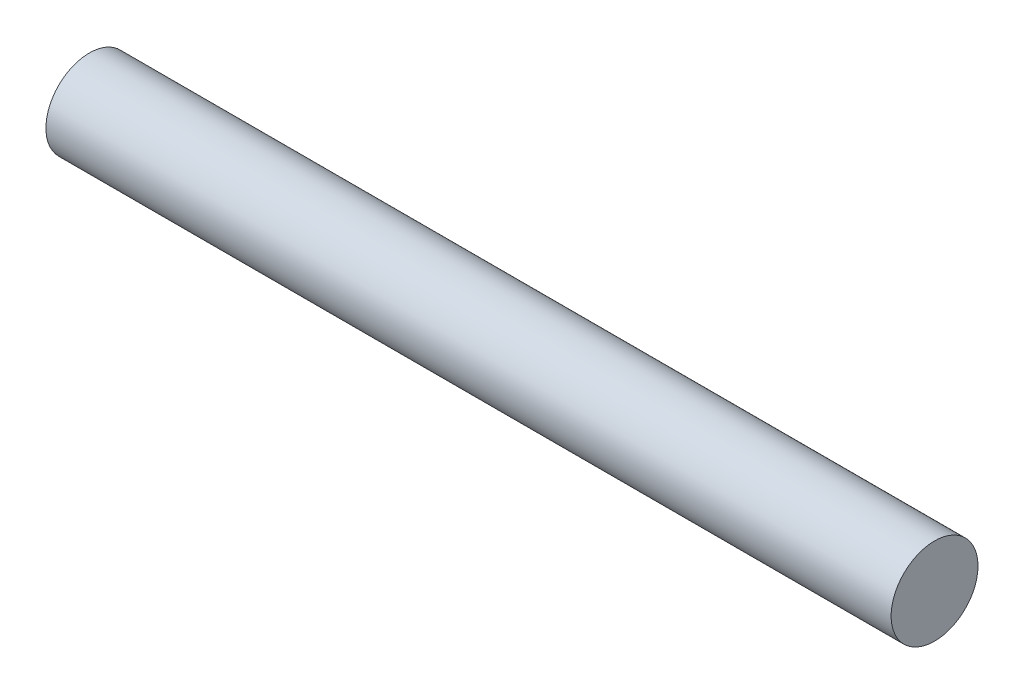
ISO-10303-21;
HEADER;
FILE_DESCRIPTION(('STEP AP214'),'2;1');
FILE_NAME('part.step','',(''),(''),'','','');
FILE_SCHEMA(('AUTOMOTIVE_DESIGN { 1 0 10303 214 1 1 1 1 }'));
ENDSEC;
DATA;
#1=APPLICATION_CONTEXT('core data for automotive mechanical design processes');
#2=APPLICATION_PROTOCOL_DEFINITION('international standard','automotive_design',2000,#1);
#3=PRODUCT_CONTEXT('',#1,'mechanical');
#4=PRODUCT('Part','Part','',(#3));
#5=PRODUCT_RELATED_PRODUCT_CATEGORY('part','',(#4));
#6=PRODUCT_DEFINITION_FORMATION('','',#4);
#7=PRODUCT_DEFINITION_CONTEXT('part definition',#1,'design');
#8=PRODUCT_DEFINITION('design','',#6,#7);
#9=PRODUCT_DEFINITION_SHAPE('','',#8);
#10=(LENGTH_UNIT() NAMED_UNIT(*) SI_UNIT(.MILLI.,.METRE.));
#11=(NAMED_UNIT(*) PLANE_ANGLE_UNIT() SI_UNIT($,.RADIAN.));
#12=(NAMED_UNIT(*) SI_UNIT($,.STERADIAN.) SOLID_ANGLE_UNIT());
#13=UNCERTAINTY_MEASURE_WITH_UNIT(LENGTH_MEASURE(1.E-05),#10,'distance_accuracy_value','');
#14=(GEOMETRIC_REPRESENTATION_CONTEXT(3) GLOBAL_UNCERTAINTY_ASSIGNED_CONTEXT((#13)) GLOBAL_UNIT_ASSIGNED_CONTEXT((#10,
#11,#12)) REPRESENTATION_CONTEXT('',''));
#15=CARTESIAN_POINT('',(0.,0.,0.));
#16=DIRECTION('',(0.,0.,1.));
#17=DIRECTION('',(1.,0.,0.));
#18=AXIS2_PLACEMENT_3D('',#15,#16,#17);
#19=CARTESIAN_POINT('',(18.,0.,0.));
#20=DIRECTION('',(-1.,0.,0.));
#21=DIRECTION('',(0.,0.,1.));
#22=AXIS2_PLACEMENT_3D('',#19,#20,#21);
#23=CYLINDRICAL_SURFACE('',#22,0.925);
#24=CARTESIAN_POINT('',(18.,0.,0.));
#25=DIRECTION('',(1.,0.,0.));
#26=DIRECTION('',(0.,0.,-1.));
#27=AXIS2_PLACEMENT_3D('',#24,#25,#26);
#28=CIRCLE('',#27,0.925);
#29=CARTESIAN_POINT('',(18.,0.,-0.925));
#30=VERTEX_POINT('',#29);
#31=EDGE_CURVE('E10',#30,#30,#28,.T.);
#32=ORIENTED_EDGE('',*,*,#31,.F.);
#33=EDGE_LOOP('',(#32));
#34=FACE_BOUND('',#33,.T.);
#35=CARTESIAN_POINT('',(0.,0.,0.));
#36=DIRECTION('',(1.,0.,0.));
#37=DIRECTION('',(0.,0.,-1.));
#38=AXIS2_PLACEMENT_3D('',#35,#36,#37);
#39=CIRCLE('',#38,0.925);
#40=CARTESIAN_POINT('',(0.,0.,-0.925));
#41=VERTEX_POINT('',#40);
#42=EDGE_CURVE('E40',#41,#41,#39,.T.);
#43=ORIENTED_EDGE('',*,*,#42,.T.);
#44=EDGE_LOOP('',(#43));
#45=FACE_BOUND('',#44,.T.);
#46=ADVANCED_FACE('F37',(#34,#45),#23,.T.);
#47=CARTESIAN_POINT('',(18.,0.,0.));
#48=DIRECTION('',(1.,0.,0.));
#49=DIRECTION('',(0.,0.,-1.));
#50=AXIS2_PLACEMENT_3D('',#47,#48,#49);
#51=PLANE('',#50);
#52=ORIENTED_EDGE('',*,*,#31,.T.);
#53=EDGE_LOOP('',(#52));
#54=FACE_BOUND('',#53,.T.);
#55=ADVANCED_FACE('F54',(#54),#51,.T.);
#56=CARTESIAN_POINT('',(0.,0.,0.));
#57=DIRECTION('',(1.,0.,0.));
#58=DIRECTION('',(0.,0.,-1.));
#59=AXIS2_PLACEMENT_3D('',#56,#57,#58);
#60=PLANE('',#59);
#61=ORIENTED_EDGE('',*,*,#42,.F.);
#62=EDGE_LOOP('',(#61));
#63=FACE_BOUND('',#62,.T.);
#64=ADVANCED_FACE('F52',(#63),#60,.F.);
#65=CLOSED_SHELL('',(#46,#55,#64));
#66=MANIFOLD_SOLID_BREP('B2',#65);
#67=ADVANCED_BREP_SHAPE_REPRESENTATION('',(#18,#66),#14);
#68=SHAPE_DEFINITION_REPRESENTATION(#9,#67);
ENDSEC;
END-ISO-10303-21;
